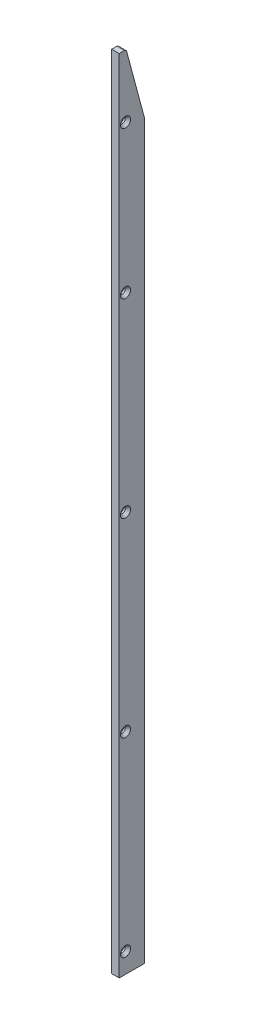
ISO-10303-21;
HEADER;
FILE_DESCRIPTION(('STEP AP214'),'2;1');
FILE_NAME('part.step','',(''),(''),'','','');
FILE_SCHEMA(('AUTOMOTIVE_DESIGN { 1 0 10303 214 1 1 1 1 }'));
ENDSEC;
DATA;
#1=APPLICATION_CONTEXT('core data for automotive mechanical design processes');
#2=APPLICATION_PROTOCOL_DEFINITION('international standard','automotive_design',2000,#1);
#3=PRODUCT_CONTEXT('',#1,'mechanical');
#4=PRODUCT('Part','Part','',(#3));
#5=PRODUCT_RELATED_PRODUCT_CATEGORY('part','',(#4));
#6=PRODUCT_DEFINITION_FORMATION('','',#4);
#7=PRODUCT_DEFINITION_CONTEXT('part definition',#1,'design');
#8=PRODUCT_DEFINITION('design','',#6,#7);
#9=PRODUCT_DEFINITION_SHAPE('','',#8);
#10=(LENGTH_UNIT() NAMED_UNIT(*) SI_UNIT(.MILLI.,.METRE.));
#11=(NAMED_UNIT(*) PLANE_ANGLE_UNIT() SI_UNIT($,.RADIAN.));
#12=(NAMED_UNIT(*) SI_UNIT($,.STERADIAN.) SOLID_ANGLE_UNIT());
#13=UNCERTAINTY_MEASURE_WITH_UNIT(LENGTH_MEASURE(1.E-05),#10,'distance_accuracy_value','');
#14=(GEOMETRIC_REPRESENTATION_CONTEXT(3) GLOBAL_UNCERTAINTY_ASSIGNED_CONTEXT((#13)) GLOBAL_UNIT_ASSIGNED_CONTEXT((#10,
#11,#12)) REPRESENTATION_CONTEXT('',''));
#15=CARTESIAN_POINT('',(0.,0.,0.));
#16=DIRECTION('',(0.,0.,1.));
#17=DIRECTION('',(1.,0.,0.));
#18=AXIS2_PLACEMENT_3D('',#15,#16,#17);
#19=CARTESIAN_POINT('',(9.52499999993961,25.4,7.9375));
#20=DIRECTION('',(1.,0.,0.));
#21=DIRECTION('',(0.,0.,-1.));
#22=AXIS2_PLACEMENT_3D('',#19,#20,#21);
#23=CONICAL_SURFACE('',#22,6.43889999993043,0.715584993328323);
#24=CARTESIAN_POINT('',(5.87258030707396,25.4,7.9375));
#25=DIRECTION('',(1.,0.,0.));
#26=DIRECTION('',(0.,0.,-1.));
#27=AXIS2_PLACEMENT_3D('',#24,#25,#26);
#28=CIRCLE('',#27,3.2639);
#29=CARTESIAN_POINT('',(5.87258030707396,25.4,4.6736));
#30=VERTEX_POINT('',#29);
#31=EDGE_CURVE('E143',#30,#30,#28,.F.);
#32=ORIENTED_EDGE('',*,*,#31,.T.);
#33=EDGE_LOOP('',(#32));
#34=FACE_BOUND('',#33,.T.);
#35=CARTESIAN_POINT('',(9.5250000000533,25.4,7.9375));
#36=DIRECTION('',(1.,0.,0.));
#37=DIRECTION('',(0.,0.,-1.));
#38=AXIS2_PLACEMENT_3D('',#35,#36,#37);
#39=CIRCLE('',#38,6.43890000002926);
#40=CARTESIAN_POINT('',(9.5250000000533,25.4,1.49859999997074));
#41=VERTEX_POINT('',#40);
#42=EDGE_CURVE('E20',#41,#41,#39,.F.);
#43=ORIENTED_EDGE('',*,*,#42,.F.);
#44=EDGE_LOOP('',(#43));
#45=FACE_BOUND('',#44,.T.);
#46=ADVANCED_FACE('F17',(#34,#45),#23,.F.);
#47=CARTESIAN_POINT('',(9.5250000000533,266.7,7.9375));
#48=DIRECTION('',(1.,0.,0.));
#49=DIRECTION('',(0.,0.,-1.));
#50=AXIS2_PLACEMENT_3D('',#47,#48,#49);
#51=CONICAL_SURFACE('',#50,6.43890000002029,0.715584993320617);
#52=CARTESIAN_POINT('',(5.87258030707396,266.7,7.9375));
#53=DIRECTION('',(1.,0.,0.));
#54=DIRECTION('',(0.,0.,-1.));
#55=AXIS2_PLACEMENT_3D('',#52,#53,#54);
#56=CIRCLE('',#55,3.2639);
#57=CARTESIAN_POINT('',(5.87258030707396,266.7,4.6736));
#58=VERTEX_POINT('',#57);
#59=EDGE_CURVE('E140',#58,#58,#56,.F.);
#60=ORIENTED_EDGE('',*,*,#59,.T.);
#61=EDGE_LOOP('',(#60));
#62=FACE_BOUND('',#61,.T.);
#63=CARTESIAN_POINT('',(9.5250000000533,266.7,7.9375));
#64=DIRECTION('',(1.,0.,0.));
#65=DIRECTION('',(0.,0.,-1.));
#66=AXIS2_PLACEMENT_3D('',#63,#64,#65);
#67=CIRCLE('',#66,6.43890000002029);
#68=CARTESIAN_POINT('',(9.5250000000533,266.7,1.49859999997971));
#69=VERTEX_POINT('',#68);
#70=EDGE_CURVE('E168',#69,#69,#67,.F.);
#71=ORIENTED_EDGE('',*,*,#70,.F.);
#72=EDGE_LOOP('',(#71));
#73=FACE_BOUND('',#72,.T.);
#74=ADVANCED_FACE('F177',(#62,#73),#51,.F.);
#75=CARTESIAN_POINT('',(9.5250000000533,508.,7.9375));
#76=DIRECTION('',(1.,0.,0.));
#77=DIRECTION('',(0.,0.,-1.));
#78=AXIS2_PLACEMENT_3D('',#75,#76,#77);
#79=CONICAL_SURFACE('',#78,6.43890000011016,0.715584993321776);
#80=CARTESIAN_POINT('',(5.87258030707396,508.,7.9375));
#81=DIRECTION('',(1.,0.,0.));
#82=DIRECTION('',(0.,0.,-1.));
#83=AXIS2_PLACEMENT_3D('',#80,#81,#82);
#84=CIRCLE('',#83,3.2639);
#85=CARTESIAN_POINT('',(5.87258030707396,508.,4.6736));
#86=VERTEX_POINT('',#85);
#87=EDGE_CURVE('E137',#86,#86,#84,.F.);
#88=ORIENTED_EDGE('',*,*,#87,.T.);
#89=EDGE_LOOP('',(#88));
#90=FACE_BOUND('',#89,.T.);
#91=CARTESIAN_POINT('',(9.52499999999645,508.,7.9375));
#92=DIRECTION('',(1.,0.,0.));
#93=DIRECTION('',(0.,0.,-1.));
#94=AXIS2_PLACEMENT_3D('',#91,#92,#93);
#95=CIRCLE('',#94,6.43890000006075);
#96=CARTESIAN_POINT('',(9.52499999999645,508.,1.49859999993925));
#97=VERTEX_POINT('',#96);
#98=EDGE_CURVE('E166',#97,#97,#95,.F.);
#99=ORIENTED_EDGE('',*,*,#98,.F.);
#100=EDGE_LOOP('',(#99));
#101=FACE_BOUND('',#100,.T.);
#102=ADVANCED_FACE('F183',(#90,#101),#79,.F.);
#103=CARTESIAN_POINT('',(9.52499999999645,749.3,7.9375));
#104=DIRECTION('',(1.,0.,0.));
#105=DIRECTION('',(0.,0.,-1.));
#106=AXIS2_PLACEMENT_3D('',#103,#104,#105);
#107=CONICAL_SURFACE('',#106,6.43890000002945,0.715584993320617);
#108=CARTESIAN_POINT('',(5.87258030707396,749.3,7.9375));
#109=DIRECTION('',(1.,0.,0.));
#110=DIRECTION('',(0.,0.,-1.));
#111=AXIS2_PLACEMENT_3D('',#108,#109,#110);
#112=CIRCLE('',#111,3.2639);
#113=CARTESIAN_POINT('',(5.87258030707396,749.3,4.6736));
#114=VERTEX_POINT('',#113);
#115=EDGE_CURVE('E134',#114,#114,#112,.F.);
#116=ORIENTED_EDGE('',*,*,#115,.T.);
#117=EDGE_LOOP('',(#116));
#118=FACE_BOUND('',#117,.T.);
#119=CARTESIAN_POINT('',(9.52499999999645,749.3,7.9375));
#120=DIRECTION('',(1.,0.,0.));
#121=DIRECTION('',(0.,0.,-1.));
#122=AXIS2_PLACEMENT_3D('',#119,#120,#121);
#123=CIRCLE('',#122,6.43890000002945);
#124=CARTESIAN_POINT('',(9.52499999999645,749.3,1.49859999997055));
#125=VERTEX_POINT('',#124);
#126=EDGE_CURVE('E163',#125,#125,#123,.F.);
#127=ORIENTED_EDGE('',*,*,#126,.F.);
#128=EDGE_LOOP('',(#127));
#129=FACE_BOUND('',#128,.T.);
#130=ADVANCED_FACE('F259',(#118,#129),#107,.F.);
#131=CARTESIAN_POINT('',(9.52499999999645,936.625,7.9375));
#132=DIRECTION('',(1.,0.,0.));
#133=DIRECTION('',(0.,0.,-1.));
#134=AXIS2_PLACEMENT_3D('',#131,#132,#133);
#135=CONICAL_SURFACE('',#134,6.43890000004232,0.715584993320617);
#136=CARTESIAN_POINT('',(5.87258030707396,936.625,7.9375));
#137=DIRECTION('',(1.,0.,0.));
#138=DIRECTION('',(0.,0.,-1.));
#139=AXIS2_PLACEMENT_3D('',#136,#137,#138);
#140=CIRCLE('',#139,3.2639);
#141=CARTESIAN_POINT('',(5.87258030707396,936.625,4.6736));
#142=VERTEX_POINT('',#141);
#143=EDGE_CURVE('E87',#142,#142,#140,.F.);
#144=ORIENTED_EDGE('',*,*,#143,.T.);
#145=EDGE_LOOP('',(#144));
#146=FACE_BOUND('',#145,.T.);
#147=CARTESIAN_POINT('',(9.52499999999645,936.625,7.9375));
#148=DIRECTION('',(1.,0.,0.));
#149=DIRECTION('',(0.,0.,-1.));
#150=AXIS2_PLACEMENT_3D('',#147,#148,#149);
#151=CIRCLE('',#150,6.43890000004232);
#152=CARTESIAN_POINT('',(9.52499999999645,936.625,1.49859999995768));
#153=VERTEX_POINT('',#152);
#154=EDGE_CURVE('E145',#153,#153,#151,.F.);
#155=ORIENTED_EDGE('',*,*,#154,.F.);
#156=EDGE_LOOP('',(#155));
#157=FACE_BOUND('',#156,.T.);
#158=ADVANCED_FACE('F255',(#146,#157),#135,.F.);
#159=CARTESIAN_POINT('',(9.525,0.,0.));
#160=DIRECTION('',(1.,0.,0.));
#161=DIRECTION('',(0.,0.,-1.));
#162=AXIS2_PLACEMENT_3D('',#159,#160,#161);
#163=PLANE('',#162);
#164=ORIENTED_EDGE('',*,*,#154,.T.);
#165=EDGE_LOOP('',(#164));
#166=FACE_BOUND('',#165,.T.);
#167=ORIENTED_EDGE('',*,*,#126,.T.);
#168=EDGE_LOOP('',(#167));
#169=FACE_BOUND('',#168,.T.);
#170=ORIENTED_EDGE('',*,*,#98,.T.);
#171=EDGE_LOOP('',(#170));
#172=FACE_BOUND('',#171,.T.);
#173=ORIENTED_EDGE('',*,*,#70,.T.);
#174=EDGE_LOOP('',(#173));
#175=FACE_BOUND('',#174,.T.);
#176=ORIENTED_EDGE('',*,*,#42,.T.);
#177=EDGE_LOOP('',(#176));
#178=FACE_BOUND('',#177,.T.);
#179=DIRECTION('',(0.,-0.965925826289076,-0.258819045102493));
#180=VECTOR('',#179,1.);
#181=CARTESIAN_POINT('',(9.525,1013.64675046826,6.45818550153306));
#182=LINE('',#181,#180);
#183=CARTESIAN_POINT('',(9.525,930.29816748173,-15.8749999999885));
#184=VERTEX_POINT('',#183);
#185=CARTESIAN_POINT('',(9.525,1013.64675046823,6.45818550152588));
#186=VERTEX_POINT('',#185);
#187=EDGE_CURVE('E83',#184,#186,#182,.F.);
#188=ORIENTED_EDGE('',*,*,#187,.T.);
#189=CARTESIAN_POINT('',(9.525,1012.825,9.525));
#190=DIRECTION('',(1.,0.,0.));
#191=DIRECTION('',(0.,0.,-1.));
#192=AXIS2_PLACEMENT_3D('',#189,#190,#191);
#193=CIRCLE('',#192,3.175);
#194=CARTESIAN_POINT('',(9.525,1016.,9.525));
#195=VERTEX_POINT('',#194);
#196=EDGE_CURVE('E78',#195,#186,#193,.F.);
#197=ORIENTED_EDGE('',*,*,#196,.F.);
#198=DIRECTION('',(0.,0.,1.));
#199=VECTOR('',#198,1.);
#200=CARTESIAN_POINT('',(9.525,1016.,-15.875));
#201=LINE('',#200,#199);
#202=CARTESIAN_POINT('',(9.525,1016.,15.875));
#203=VERTEX_POINT('',#202);
#204=EDGE_CURVE('E68',#203,#195,#201,.F.);
#205=ORIENTED_EDGE('',*,*,#204,.F.);
#206=DIRECTION('',(0.,1.,0.));
#207=VECTOR('',#206,1.);
#208=CARTESIAN_POINT('',(9.525,1016.,15.875));
#209=LINE('',#208,#207);
#210=CARTESIAN_POINT('',(9.525,0.,15.875));
#211=VERTEX_POINT('',#210);
#212=EDGE_CURVE('E92',#211,#203,#209,.T.);
#213=ORIENTED_EDGE('',*,*,#212,.F.);
#214=DIRECTION('',(0.,0.,-1.));
#215=VECTOR('',#214,1.);
#216=CARTESIAN_POINT('',(9.525,0.,15.875));
#217=LINE('',#216,#215);
#218=CARTESIAN_POINT('',(9.525,0.,-15.875));
#219=VERTEX_POINT('',#218);
#220=EDGE_CURVE('E124',#219,#211,#217,.F.);
#221=ORIENTED_EDGE('',*,*,#220,.F.);
#222=DIRECTION('',(0.,1.,0.));
#223=VECTOR('',#222,1.);
#224=CARTESIAN_POINT('',(9.525,0.,-15.875));
#225=LINE('',#224,#223);
#226=EDGE_CURVE('E118',#184,#219,#225,.F.);
#227=ORIENTED_EDGE('',*,*,#226,.F.);
#228=EDGE_LOOP('',(#188,#197,#205,#213,#221,#227));
#229=FACE_BOUND('',#228,.T.);
#230=ADVANCED_FACE('F82',(#166,#169,#172,#175,#178,#229),#163,.T.);
#231=CARTESIAN_POINT('',(-1.54357493357853,25.4,7.9375));
#232=DIRECTION('',(1.,0.,0.));
#233=DIRECTION('',(0.,0.,-1.));
#234=AXIS2_PLACEMENT_3D('',#231,#232,#233);
#235=CYLINDRICAL_SURFACE('',#234,3.2639);
#236=ORIENTED_EDGE('',*,*,#31,.F.);
#237=EDGE_LOOP('',(#236));
#238=FACE_BOUND('',#237,.T.);
#239=CARTESIAN_POINT('',(3.65241969291219,25.4,7.9375));
#240=DIRECTION('',(-1.,0.,0.));
#241=DIRECTION('',(0.,1.,0.));
#242=AXIS2_PLACEMENT_3D('',#239,#240,#241);
#243=CIRCLE('',#242,3.26389999996955);
#244=CARTESIAN_POINT('',(3.65241969291219,28.6638999999695,7.9375));
#245=VERTEX_POINT('',#244);
#246=EDGE_CURVE('E111',#245,#245,#243,.T.);
#247=ORIENTED_EDGE('',*,*,#246,.T.);
#248=EDGE_LOOP('',(#247));
#249=FACE_BOUND('',#248,.T.);
#250=ADVANCED_FACE('F248',(#238,#249),#235,.F.);
#251=CARTESIAN_POINT('',(-1.54357493357853,266.7,7.9375));
#252=DIRECTION('',(1.,0.,0.));
#253=DIRECTION('',(0.,0.,-1.));
#254=AXIS2_PLACEMENT_3D('',#251,#252,#253);
#255=CYLINDRICAL_SURFACE('',#254,3.2639);
#256=ORIENTED_EDGE('',*,*,#59,.F.);
#257=EDGE_LOOP('',(#256));
#258=FACE_BOUND('',#257,.T.);
#259=CARTESIAN_POINT('',(3.65241969291219,266.7,7.9375));
#260=DIRECTION('',(-1.,0.,0.));
#261=DIRECTION('',(0.,1.,0.));
#262=AXIS2_PLACEMENT_3D('',#259,#260,#261);
#263=CIRCLE('',#262,3.26389999999338);
#264=CARTESIAN_POINT('',(3.65241969291219,269.963899999993,7.9375));
#265=VERTEX_POINT('',#264);
#266=EDGE_CURVE('E108',#265,#265,#263,.T.);
#267=ORIENTED_EDGE('',*,*,#266,.T.);
#268=EDGE_LOOP('',(#267));
#269=FACE_BOUND('',#268,.T.);
#270=ADVANCED_FACE('F244',(#258,#269),#255,.F.);
#271=CARTESIAN_POINT('',(-1.54357493357853,508.,7.9375));
#272=DIRECTION('',(1.,0.,0.));
#273=DIRECTION('',(0.,0.,-1.));
#274=AXIS2_PLACEMENT_3D('',#271,#272,#273);
#275=CYLINDRICAL_SURFACE('',#274,3.2639);
#276=ORIENTED_EDGE('',*,*,#87,.F.);
#277=EDGE_LOOP('',(#276));
#278=FACE_BOUND('',#277,.T.);
#279=CARTESIAN_POINT('',(3.65241969291219,508.,7.9375));
#280=DIRECTION('',(-1.,0.,0.));
#281=DIRECTION('',(0.,1.,0.));
#282=AXIS2_PLACEMENT_3D('',#279,#280,#281);
#283=CIRCLE('',#282,3.26390000007404);
#284=CARTESIAN_POINT('',(3.65241969291219,511.263900000074,7.9375));
#285=VERTEX_POINT('',#284);
#286=EDGE_CURVE('E105',#285,#285,#283,.T.);
#287=ORIENTED_EDGE('',*,*,#286,.T.);
#288=EDGE_LOOP('',(#287));
#289=FACE_BOUND('',#288,.T.);
#290=ADVANCED_FACE('F240',(#278,#289),#275,.F.);
#291=CARTESIAN_POINT('',(-1.54357493357853,749.3,7.9375));
#292=DIRECTION('',(1.,0.,0.));
#293=DIRECTION('',(0.,0.,-1.));
#294=AXIS2_PLACEMENT_3D('',#291,#292,#293);
#295=CYLINDRICAL_SURFACE('',#294,3.2639);
#296=ORIENTED_EDGE('',*,*,#115,.F.);
#297=EDGE_LOOP('',(#296));
#298=FACE_BOUND('',#297,.T.);
#299=CARTESIAN_POINT('',(3.65241969291219,749.3,7.9375));
#300=DIRECTION('',(-1.,0.,0.));
#301=DIRECTION('',(0.,1.,0.));
#302=AXIS2_PLACEMENT_3D('',#299,#300,#301);
#303=CIRCLE('',#302,3.26390000009791);
#304=CARTESIAN_POINT('',(3.65241969291219,752.563900000098,7.9375));
#305=VERTEX_POINT('',#304);
#306=EDGE_CURVE('E102',#305,#305,#303,.T.);
#307=ORIENTED_EDGE('',*,*,#306,.T.);
#308=EDGE_LOOP('',(#307));
#309=FACE_BOUND('',#308,.T.);
#310=ADVANCED_FACE('F236',(#298,#309),#295,.F.);
#311=CARTESIAN_POINT('',(-1.54357493357853,936.625,7.9375));
#312=DIRECTION('',(1.,0.,0.));
#313=DIRECTION('',(0.,0.,-1.));
#314=AXIS2_PLACEMENT_3D('',#311,#312,#313);
#315=CYLINDRICAL_SURFACE('',#314,3.2639);
#316=ORIENTED_EDGE('',*,*,#143,.F.);
#317=EDGE_LOOP('',(#316));
#318=FACE_BOUND('',#317,.T.);
#319=CARTESIAN_POINT('',(3.65241969291219,936.625,7.9375));
#320=DIRECTION('',(-1.,0.,0.));
#321=DIRECTION('',(0.,1.,0.));
#322=AXIS2_PLACEMENT_3D('',#319,#320,#321);
#323=CIRCLE('',#322,3.26390000008503);
#324=CARTESIAN_POINT('',(3.65241969291219,939.888900000085,7.9375));
#325=VERTEX_POINT('',#324);
#326=EDGE_CURVE('E99',#325,#325,#323,.T.);
#327=ORIENTED_EDGE('',*,*,#326,.T.);
#328=EDGE_LOOP('',(#327));
#329=FACE_BOUND('',#328,.T.);
#330=ADVANCED_FACE('F233',(#318,#329),#315,.F.);
#331=CARTESIAN_POINT('',(9.525,1012.825,9.525));
#332=DIRECTION('',(1.,0.,0.));
#333=DIRECTION('',(0.,0.,-1.));
#334=AXIS2_PLACEMENT_3D('',#331,#332,#333);
#335=CYLINDRICAL_SURFACE('',#334,3.175);
#336=DIRECTION('',(1.,0.,0.));
#337=VECTOR('',#336,1.);
#338=CARTESIAN_POINT('',(9.525,1013.64675046825,6.4581855015327));
#339=LINE('',#338,#337);
#340=CARTESIAN_POINT('',(0.,1013.64675046823,6.45818550151757));
#341=VERTEX_POINT('',#340);
#342=EDGE_CURVE('E114',#186,#341,#339,.F.);
#343=ORIENTED_EDGE('',*,*,#342,.T.);
#344=CARTESIAN_POINT('',(0.,1012.825,9.525));
#345=DIRECTION('',(1.,0.,0.));
#346=DIRECTION('',(0.,0.,-1.));
#347=AXIS2_PLACEMENT_3D('',#344,#345,#346);
#348=CIRCLE('',#347,3.175);
#349=CARTESIAN_POINT('',(0.,1016.,9.525));
#350=VERTEX_POINT('',#349);
#351=EDGE_CURVE('E91',#341,#350,#348,.T.);
#352=ORIENTED_EDGE('',*,*,#351,.T.);
#353=DIRECTION('',(1.,0.,0.));
#354=VECTOR('',#353,1.);
#355=CARTESIAN_POINT('',(0.,1016.,9.525));
#356=LINE('',#355,#354);
#357=EDGE_CURVE('E73',#195,#350,#356,.F.);
#358=ORIENTED_EDGE('',*,*,#357,.F.);
#359=ORIENTED_EDGE('',*,*,#196,.T.);
#360=EDGE_LOOP('',(#343,#352,#358,#359));
#361=FACE_BOUND('',#360,.T.);
#362=ADVANCED_FACE('F90',(#361),#335,.T.);
#363=CARTESIAN_POINT('',(0.,1016.,-15.875));
#364=DIRECTION('',(0.,1.,0.));
#365=DIRECTION('',(0.,0.,1.));
#366=AXIS2_PLACEMENT_3D('',#363,#364,#365);
#367=PLANE('',#366);
#368=ORIENTED_EDGE('',*,*,#204,.T.);
#369=ORIENTED_EDGE('',*,*,#357,.T.);
#370=DIRECTION('',(0.,0.,-1.));
#371=VECTOR('',#370,1.);
#372=CARTESIAN_POINT('',(0.,1016.,0.));
#373=LINE('',#372,#371);
#374=CARTESIAN_POINT('',(0.,1016.,15.875));
#375=VERTEX_POINT('',#374);
#376=EDGE_CURVE('E159',#350,#375,#373,.F.);
#377=ORIENTED_EDGE('',*,*,#376,.T.);
#378=DIRECTION('',(1.,0.,0.));
#379=VECTOR('',#378,1.);
#380=CARTESIAN_POINT('',(0.,1016.,15.875));
#381=LINE('',#380,#379);
#382=EDGE_CURVE('E75',#203,#375,#381,.F.);
#383=ORIENTED_EDGE('',*,*,#382,.F.);
#384=EDGE_LOOP('',(#368,#369,#377,#383));
#385=FACE_BOUND('',#384,.T.);
#386=ADVANCED_FACE('F70',(#385),#367,.T.);
#387=CARTESIAN_POINT('',(0.,1016.,15.875));
#388=DIRECTION('',(0.,0.,1.));
#389=DIRECTION('',(1.,0.,0.));
#390=AXIS2_PLACEMENT_3D('',#387,#388,#389);
#391=PLANE('',#390);
#392=ORIENTED_EDGE('',*,*,#382,.T.);
#393=DIRECTION('',(0.,1.,0.));
#394=VECTOR('',#393,1.);
#395=CARTESIAN_POINT('',(0.,0.,15.875));
#396=LINE('',#395,#394);
#397=CARTESIAN_POINT('',(0.,0.,15.875));
#398=VERTEX_POINT('',#397);
#399=EDGE_CURVE('E293',#375,#398,#396,.F.);
#400=ORIENTED_EDGE('',*,*,#399,.T.);
#401=DIRECTION('',(1.,0.,0.));
#402=VECTOR('',#401,1.);
#403=CARTESIAN_POINT('',(0.,0.,15.875));
#404=LINE('',#403,#402);
#405=EDGE_CURVE('E121',#211,#398,#404,.F.);
#406=ORIENTED_EDGE('',*,*,#405,.F.);
#407=ORIENTED_EDGE('',*,*,#212,.T.);
#408=EDGE_LOOP('',(#392,#400,#406,#407));
#409=FACE_BOUND('',#408,.T.);
#410=ADVANCED_FACE('F224',(#409),#391,.T.);
#411=CARTESIAN_POINT('',(0.,0.,15.875));
#412=DIRECTION('',(0.,-1.,0.));
#413=DIRECTION('',(0.,0.,-1.));
#414=AXIS2_PLACEMENT_3D('',#411,#412,#413);
#415=PLANE('',#414);
#416=ORIENTED_EDGE('',*,*,#405,.T.);
#417=DIRECTION('',(0.,0.,-1.));
#418=VECTOR('',#417,1.);
#419=CARTESIAN_POINT('',(0.,0.,0.));
#420=LINE('',#419,#418);
#421=CARTESIAN_POINT('',(0.,0.,-15.875));
#422=VERTEX_POINT('',#421);
#423=EDGE_CURVE('E288',#398,#422,#420,.T.);
#424=ORIENTED_EDGE('',*,*,#423,.T.);
#425=DIRECTION('',(-1.,0.,0.));
#426=VECTOR('',#425,1.);
#427=CARTESIAN_POINT('',(0.,0.,-15.875));
#428=LINE('',#427,#426);
#429=EDGE_CURVE('E120',#219,#422,#428,.T.);
#430=ORIENTED_EDGE('',*,*,#429,.F.);
#431=ORIENTED_EDGE('',*,*,#220,.T.);
#432=EDGE_LOOP('',(#416,#424,#430,#431));
#433=FACE_BOUND('',#432,.T.);
#434=ADVANCED_FACE('F220',(#433),#415,.T.);
#435=CARTESIAN_POINT('',(0.,0.,-15.875));
#436=DIRECTION('',(0.,0.,-1.));
#437=DIRECTION('',(-1.,0.,0.));
#438=AXIS2_PLACEMENT_3D('',#435,#436,#437);
#439=PLANE('',#438);
#440=DIRECTION('',(0.,1.,0.));
#441=VECTOR('',#440,1.);
#442=CARTESIAN_POINT('',(0.,0.,-15.875));
#443=LINE('',#442,#441);
#444=CARTESIAN_POINT('',(0.,930.298167481718,-15.8749999999943));
#445=VERTEX_POINT('',#444);
#446=EDGE_CURVE('E285',#422,#445,#443,.T.);
#447=ORIENTED_EDGE('',*,*,#446,.T.);
#448=DIRECTION('',(1.,0.,0.));
#449=VECTOR('',#448,1.);
#450=CARTESIAN_POINT('',(9.525,930.298167481729,-15.8749999999828));
#451=LINE('',#450,#449);
#452=EDGE_CURVE('E35',#445,#184,#451,.T.);
#453=ORIENTED_EDGE('',*,*,#452,.T.);
#454=ORIENTED_EDGE('',*,*,#226,.T.);
#455=ORIENTED_EDGE('',*,*,#429,.T.);
#456=EDGE_LOOP('',(#447,#453,#454,#455));
#457=FACE_BOUND('',#456,.T.);
#458=ADVANCED_FACE('F217',(#457),#439,.T.);
#459=CARTESIAN_POINT('',(9.525,1013.64675046826,6.45818550153306));
#460=DIRECTION('',(0.,-0.258819045102493,0.965925826289076));
#461=DIRECTION('',(0.,-0.965925826289076,-0.258819045102493));
#462=AXIS2_PLACEMENT_3D('',#459,#460,#461);
#463=PLANE('',#462);
#464=ORIENTED_EDGE('',*,*,#187,.F.);
#465=ORIENTED_EDGE('',*,*,#452,.F.);
#466=DIRECTION('',(0.,0.96592582628909,0.258819045102442));
#467=VECTOR('',#466,1.);
#468=CARTESIAN_POINT('',(0.,930.298167481732,-15.8749999999949));
#469=LINE('',#468,#467);
#470=EDGE_CURVE('E158',#445,#341,#469,.T.);
#471=ORIENTED_EDGE('',*,*,#470,.T.);
#472=ORIENTED_EDGE('',*,*,#342,.F.);
#473=EDGE_LOOP('',(#464,#465,#471,#472));
#474=FACE_BOUND('',#473,.T.);
#475=ADVANCED_FACE('F213',(#474),#463,.F.);
#476=CARTESIAN_POINT('',(5.6843418860808E-11,25.4,7.9375));
#477=DIRECTION('',(-1.,0.,0.));
#478=DIRECTION('',(0.,0.,1.));
#479=AXIS2_PLACEMENT_3D('',#476,#477,#478);
#480=CONICAL_SURFACE('',#479,6.43889999991152,0.715584993320617);
#481=ORIENTED_EDGE('',*,*,#246,.F.);
#482=EDGE_LOOP('',(#481));
#483=FACE_BOUND('',#482,.T.);
#484=CARTESIAN_POINT('',(0.,25.4,7.9375));
#485=DIRECTION('',(-1.,0.,0.));
#486=DIRECTION('',(0.,0.,1.));
#487=AXIS2_PLACEMENT_3D('',#484,#485,#486);
#488=CIRCLE('',#487,6.43889999996093);
#489=CARTESIAN_POINT('',(0.,25.4,14.3763999999609));
#490=VERTEX_POINT('',#489);
#491=EDGE_CURVE('E155',#490,#490,#488,.T.);
#492=ORIENTED_EDGE('',*,*,#491,.T.);
#493=EDGE_LOOP('',(#492));
#494=FACE_BOUND('',#493,.T.);
#495=ADVANCED_FACE('F209',(#483,#494),#480,.F.);
#496=CARTESIAN_POINT('',(-1.13686837721616E-10,266.7,7.9375));
#497=DIRECTION('',(-1.,0.,0.));
#498=DIRECTION('',(0.,0.,1.));
#499=AXIS2_PLACEMENT_3D('',#496,#497,#498);
#500=CONICAL_SURFACE('',#499,6.43890000010589,0.715584993320617);
#501=ORIENTED_EDGE('',*,*,#266,.F.);
#502=EDGE_LOOP('',(#501));
#503=FACE_BOUND('',#502,.T.);
#504=CARTESIAN_POINT('',(-5.6843418860808E-11,266.7,7.9375));
#505=DIRECTION('',(-1.,0.,0.));
#506=DIRECTION('',(0.,0.,1.));
#507=AXIS2_PLACEMENT_3D('',#504,#505,#506);
#508=CIRCLE('',#507,6.43890000005647);
#509=CARTESIAN_POINT('',(-5.6843418860808E-11,266.7,14.3764000000565));
#510=VERTEX_POINT('',#509);
#511=EDGE_CURVE('E152',#510,#510,#508,.T.);
#512=ORIENTED_EDGE('',*,*,#511,.T.);
#513=EDGE_LOOP('',(#512));
#514=FACE_BOUND('',#513,.T.);
#515=ADVANCED_FACE('F205',(#503,#514),#500,.F.);
#516=CARTESIAN_POINT('',(-5.6843418860808E-11,508.,7.9375));
#517=DIRECTION('',(-1.,0.,0.));
#518=DIRECTION('',(0.,0.,1.));
#519=AXIS2_PLACEMENT_3D('',#516,#517,#518);
#520=CONICAL_SURFACE('',#519,6.43890000007286,0.715584993311753);
#521=ORIENTED_EDGE('',*,*,#286,.F.);
#522=EDGE_LOOP('',(#521));
#523=FACE_BOUND('',#522,.T.);
#524=CARTESIAN_POINT('',(5.6843418860808E-11,508.,7.9375));
#525=DIRECTION('',(-1.,0.,0.));
#526=DIRECTION('',(0.,0.,1.));
#527=AXIS2_PLACEMENT_3D('',#524,#525,#526);
#528=CIRCLE('',#527,6.43889999997403);
#529=CARTESIAN_POINT('',(5.6843418860808E-11,508.,14.376399999974));
#530=VERTEX_POINT('',#529);
#531=EDGE_CURVE('E149',#530,#530,#528,.T.);
#532=ORIENTED_EDGE('',*,*,#531,.T.);
#533=EDGE_LOOP('',(#532));
#534=FACE_BOUND('',#533,.T.);
#535=ADVANCED_FACE('F201',(#523,#534),#520,.F.);
#536=CARTESIAN_POINT('',(-5.6843418860808E-11,749.3,7.9375));
#537=DIRECTION('',(-1.,0.,0.));
#538=DIRECTION('',(0.,0.,1.));
#539=AXIS2_PLACEMENT_3D('',#536,#537,#538);
#540=CONICAL_SURFACE('',#539,6.43890000009673,0.715584993311753);
#541=ORIENTED_EDGE('',*,*,#306,.F.);
#542=EDGE_LOOP('',(#541));
#543=FACE_BOUND('',#542,.T.);
#544=CARTESIAN_POINT('',(5.6843418860808E-11,749.3,7.9375));
#545=DIRECTION('',(-1.,0.,0.));
#546=DIRECTION('',(0.,0.,1.));
#547=AXIS2_PLACEMENT_3D('',#544,#545,#546);
#548=CIRCLE('',#547,6.4388999999979);
#549=CARTESIAN_POINT('',(5.6843418860808E-11,749.3,14.3763999999979));
#550=VERTEX_POINT('',#549);
#551=EDGE_CURVE('E26',#550,#550,#548,.T.);
#552=ORIENTED_EDGE('',*,*,#551,.T.);
#553=EDGE_LOOP('',(#552));
#554=FACE_BOUND('',#553,.T.);
#555=ADVANCED_FACE('F193',(#543,#554),#540,.F.);
#556=CARTESIAN_POINT('',(-5.6843418860808E-11,936.625,7.9375));
#557=DIRECTION('',(-1.,0.,0.));
#558=DIRECTION('',(0.,0.,1.));
#559=AXIS2_PLACEMENT_3D('',#556,#557,#558);
#560=CONICAL_SURFACE('',#559,6.43890000008385,0.715584993311753);
#561=ORIENTED_EDGE('',*,*,#326,.F.);
#562=EDGE_LOOP('',(#561));
#563=FACE_BOUND('',#562,.T.);
#564=CARTESIAN_POINT('',(5.6843418860808E-11,936.625,7.9375));
#565=DIRECTION('',(-1.,0.,0.));
#566=DIRECTION('',(0.,0.,1.));
#567=AXIS2_PLACEMENT_3D('',#564,#565,#566);
#568=CIRCLE('',#567,6.43889999998502);
#569=CARTESIAN_POINT('',(5.6843418860808E-11,936.625,14.376399999985));
#570=VERTEX_POINT('',#569);
#571=EDGE_CURVE('E11',#570,#570,#568,.T.);
#572=ORIENTED_EDGE('',*,*,#571,.T.);
#573=EDGE_LOOP('',(#572));
#574=FACE_BOUND('',#573,.T.);
#575=ADVANCED_FACE('F187',(#563,#574),#560,.F.);
#576=CARTESIAN_POINT('',(0.,0.,0.));
#577=DIRECTION('',(1.,0.,0.));
#578=DIRECTION('',(0.,0.,-1.));
#579=AXIS2_PLACEMENT_3D('',#576,#577,#578);
#580=PLANE('',#579);
#581=ORIENTED_EDGE('',*,*,#571,.F.);
#582=EDGE_LOOP('',(#581));
#583=FACE_BOUND('',#582,.T.);
#584=ORIENTED_EDGE('',*,*,#551,.F.);
#585=EDGE_LOOP('',(#584));
#586=FACE_BOUND('',#585,.T.);
#587=ORIENTED_EDGE('',*,*,#531,.F.);
#588=EDGE_LOOP('',(#587));
#589=FACE_BOUND('',#588,.T.);
#590=ORIENTED_EDGE('',*,*,#511,.F.);
#591=EDGE_LOOP('',(#590));
#592=FACE_BOUND('',#591,.T.);
#593=ORIENTED_EDGE('',*,*,#491,.F.);
#594=EDGE_LOOP('',(#593));
#595=FACE_BOUND('',#594,.T.);
#596=ORIENTED_EDGE('',*,*,#446,.F.);
#597=ORIENTED_EDGE('',*,*,#423,.F.);
#598=ORIENTED_EDGE('',*,*,#399,.F.);
#599=ORIENTED_EDGE('',*,*,#376,.F.);
#600=ORIENTED_EDGE('',*,*,#351,.F.);
#601=ORIENTED_EDGE('',*,*,#470,.F.);
#602=EDGE_LOOP('',(#596,#597,#598,#599,#600,#601));
#603=FACE_BOUND('',#602,.T.);
#604=ADVANCED_FACE('F185',(#583,#586,#589,#592,#595,#603),#580,.F.);
#605=CLOSED_SHELL('',(#46,#74,#102,#130,#158,#230,#250,#270,#290,#310,#330,#362,#386,#410,#434,
#458,#475,#495,#515,#535,#555,#575,#604));
#606=MANIFOLD_SOLID_BREP('B1',#605);
#607=ADVANCED_BREP_SHAPE_REPRESENTATION('',(#18,#606),#14);
#608=SHAPE_DEFINITION_REPRESENTATION(#9,#607);
ENDSEC;
END-ISO-10303-21;
